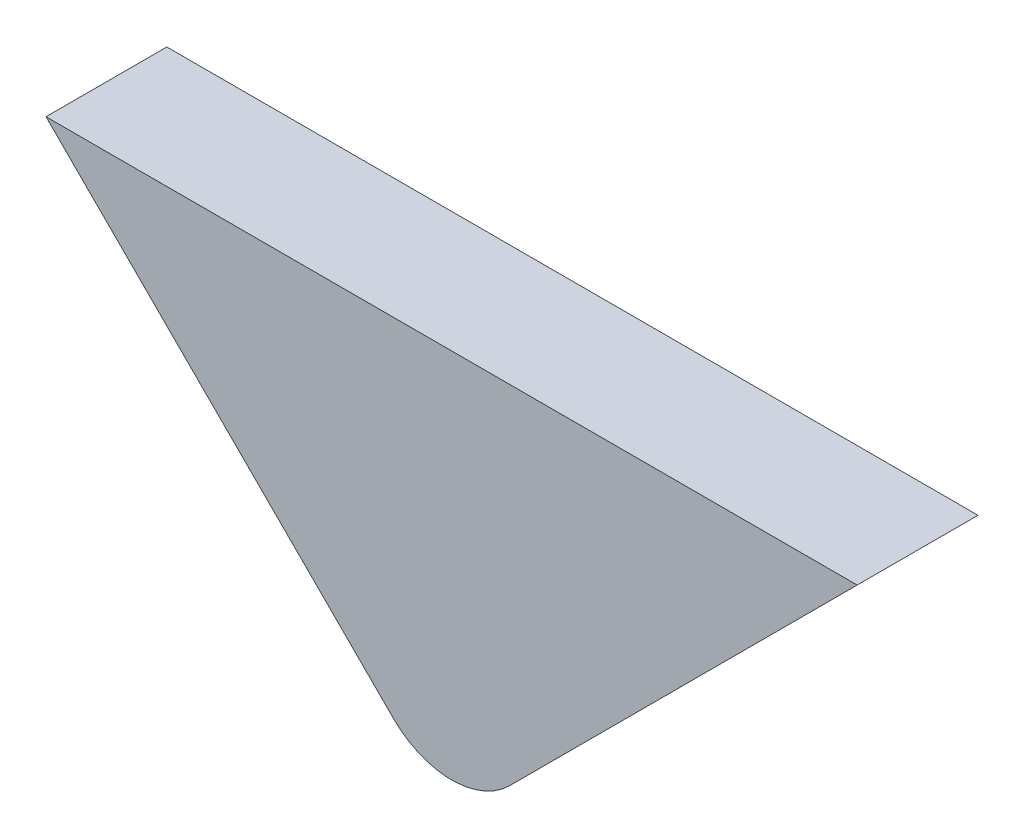
ISO-10303-21;
HEADER;
FILE_DESCRIPTION(('STEP AP214'),'2;1');
FILE_NAME('part.step','',(''),(''),'','','');
FILE_SCHEMA(('AUTOMOTIVE_DESIGN { 1 0 10303 214 1 1 1 1 }'));
ENDSEC;
DATA;
#1=APPLICATION_CONTEXT('core data for automotive mechanical design processes');
#2=APPLICATION_PROTOCOL_DEFINITION('international standard','automotive_design',2000,#1);
#3=PRODUCT_CONTEXT('',#1,'mechanical');
#4=PRODUCT('Part','Part','',(#3));
#5=PRODUCT_RELATED_PRODUCT_CATEGORY('part','',(#4));
#6=PRODUCT_DEFINITION_FORMATION('','',#4);
#7=PRODUCT_DEFINITION_CONTEXT('part definition',#1,'design');
#8=PRODUCT_DEFINITION('design','',#6,#7);
#9=PRODUCT_DEFINITION_SHAPE('','',#8);
#10=(LENGTH_UNIT() NAMED_UNIT(*) SI_UNIT(.MILLI.,.METRE.));
#11=(NAMED_UNIT(*) PLANE_ANGLE_UNIT() SI_UNIT($,.RADIAN.));
#12=(NAMED_UNIT(*) SI_UNIT($,.STERADIAN.) SOLID_ANGLE_UNIT());
#13=UNCERTAINTY_MEASURE_WITH_UNIT(LENGTH_MEASURE(1.E-05),#10,'distance_accuracy_value','');
#14=(GEOMETRIC_REPRESENTATION_CONTEXT(3) GLOBAL_UNCERTAINTY_ASSIGNED_CONTEXT((#13)) GLOBAL_UNIT_ASSIGNED_CONTEXT((#10,
#11,#12)) REPRESENTATION_CONTEXT('',''));
#15=CARTESIAN_POINT('',(0.,0.,0.));
#16=DIRECTION('',(0.,0.,1.));
#17=DIRECTION('',(1.,0.,0.));
#18=AXIS2_PLACEMENT_3D('',#15,#16,#17);
#19=CARTESIAN_POINT('',(0.,13.6568542494926,9.5));
#20=DIRECTION('',(0.,0.,-1.));
#21=DIRECTION('',(-1.,0.,0.));
#22=AXIS2_PLACEMENT_3D('',#19,#20,#21);
#23=CYLINDRICAL_SURFACE('',#22,6.45685424949255);
#24=CARTESIAN_POINT('',(0.,13.6568542494926,0.));
#25=DIRECTION('',(0.,0.,1.));
#26=DIRECTION('',(1.,0.,0.));
#27=AXIS2_PLACEMENT_3D('',#24,#25,#26);
#28=CIRCLE('',#27,6.45685424949255);
#29=CARTESIAN_POINT('',(-4.56568542494934,9.09116882454317,0.));
#30=VERTEX_POINT('',#29);
#31=CARTESIAN_POINT('',(4.56568542494934,9.09116882454317,0.));
#32=VERTEX_POINT('',#31);
#33=EDGE_CURVE('E95',#30,#32,#28,.T.);
#34=ORIENTED_EDGE('',*,*,#33,.T.);
#35=DIRECTION('',(0.,0.,-1.));
#36=VECTOR('',#35,1.);
#37=CARTESIAN_POINT('',(4.56568542494934,9.09116882454317,9.5));
#38=LINE('',#37,#36);
#39=CARTESIAN_POINT('',(4.56568542494934,9.09116882454317,9.5));
#40=VERTEX_POINT('',#39);
#41=EDGE_CURVE('E11',#40,#32,#38,.T.);
#42=ORIENTED_EDGE('',*,*,#41,.F.);
#43=CARTESIAN_POINT('',(0.,13.6568542494926,9.5));
#44=DIRECTION('',(0.,0.,1.));
#45=DIRECTION('',(1.,0.,0.));
#46=AXIS2_PLACEMENT_3D('',#43,#44,#45);
#47=CIRCLE('',#46,6.45685424949255);
#48=CARTESIAN_POINT('',(-4.56568542494934,9.09116882454317,9.5));
#49=VERTEX_POINT('',#48);
#50=EDGE_CURVE('E83',#49,#40,#47,.T.);
#51=ORIENTED_EDGE('',*,*,#50,.F.);
#52=DIRECTION('',(0.,0.,-1.));
#53=VECTOR('',#52,1.);
#54=CARTESIAN_POINT('',(-4.56568542494934,9.09116882454317,9.5));
#55=LINE('',#54,#53);
#56=EDGE_CURVE('E91',#49,#30,#55,.T.);
#57=ORIENTED_EDGE('',*,*,#56,.T.);
#58=EDGE_LOOP('',(#34,#42,#51,#57));
#59=FACE_BOUND('',#58,.T.);
#60=ADVANCED_FACE('F32',(#59),#23,.T.);
#61=CARTESIAN_POINT('',(4.56568542494934,9.09116882454317,9.5));
#62=DIRECTION('',(-0.707106781186544,0.707106781186551,0.));
#63=DIRECTION('',(-0.707106781186551,-0.707106781186544,0.));
#64=AXIS2_PLACEMENT_3D('',#61,#62,#63);
#65=PLANE('',#64);
#66=CARTESIAN_POINT('',(10.6773123959166,15.2027957955105,4.75));
#67=DIRECTION('',(-0.707106781186551,0.707106781186544,0.));
#68=DIRECTION('',(-0.707106781186544,-0.707106781186551,0.));
#69=AXIS2_PLACEMENT_3D('',#66,#67,#68);
#70=CIRCLE('',#69,1.5);
#71=CARTESIAN_POINT('',(9.61665222413675,14.1421356237306,4.75));
#72=VERTEX_POINT('',#71);
#73=EDGE_CURVE('E127',#72,#72,#70,.T.);
#74=ORIENTED_EDGE('',*,*,#73,.T.);
#75=EDGE_LOOP('',(#74));
#76=FACE_BOUND('',#75,.T.);
#77=CARTESIAN_POINT('',(21.2839141137147,25.8093975133087,4.75));
#78=DIRECTION('',(-0.707106781186551,0.707106781186544,0.));
#79=DIRECTION('',(-0.707106781186544,-0.707106781186551,0.));
#80=AXIS2_PLACEMENT_3D('',#77,#78,#79);
#81=CIRCLE('',#80,1.5);
#82=CARTESIAN_POINT('',(20.2232539419349,24.7487373415289,4.75));
#83=VERTEX_POINT('',#82);
#84=EDGE_CURVE('E121',#83,#83,#81,.T.);
#85=ORIENTED_EDGE('',*,*,#84,.T.);
#86=EDGE_LOOP('',(#85));
#87=FACE_BOUND('',#86,.T.);
#88=DIRECTION('',(0.707106781186551,0.707106781186544,0.));
#89=VECTOR('',#88,1.);
#90=CARTESIAN_POINT('',(4.56568542494934,9.09116882454317,0.));
#91=LINE('',#90,#89);
#92=CARTESIAN_POINT('',(31.8905158315135,36.415999231107,0.));
#93=VERTEX_POINT('',#92);
#94=EDGE_CURVE('E87',#32,#93,#91,.T.);
#95=ORIENTED_EDGE('',*,*,#94,.T.);
#96=DIRECTION('',(0.,0.,-1.));
#97=VECTOR('',#96,1.);
#98=CARTESIAN_POINT('',(31.8905158315135,36.415999231107,9.5));
#99=LINE('',#98,#97);
#100=CARTESIAN_POINT('',(31.8905158315135,36.415999231107,9.5));
#101=VERTEX_POINT('',#100);
#102=EDGE_CURVE('E40',#101,#93,#99,.T.);
#103=ORIENTED_EDGE('',*,*,#102,.F.);
#104=DIRECTION('',(0.707106781186551,0.707106781186544,0.));
#105=VECTOR('',#104,1.);
#106=CARTESIAN_POINT('',(4.56568542494934,9.09116882454317,9.5));
#107=LINE('',#106,#105);
#108=EDGE_CURVE('E78',#40,#101,#107,.T.);
#109=ORIENTED_EDGE('',*,*,#108,.F.);
#110=ORIENTED_EDGE('',*,*,#41,.T.);
#111=EDGE_LOOP('',(#95,#103,#109,#110));
#112=FACE_BOUND('',#111,.T.);
#113=ADVANCED_FACE('F86',(#76,#87,#112),#65,.F.);
#114=CARTESIAN_POINT('',(31.8905158315135,36.415999231107,9.5));
#115=DIRECTION('',(0.,-1.,0.));
#116=DIRECTION('',(1.,0.,0.));
#117=AXIS2_PLACEMENT_3D('',#114,#115,#116);
#118=PLANE('',#117);
#119=DIRECTION('',(-1.,0.,0.));
#120=VECTOR('',#119,1.);
#121=CARTESIAN_POINT('',(31.8905158315135,36.415999231107,0.));
#122=LINE('',#121,#120);
#123=CARTESIAN_POINT('',(-31.8905158315129,36.415999231107,0.));
#124=VERTEX_POINT('',#123);
#125=EDGE_CURVE('E65',#93,#124,#122,.T.);
#126=ORIENTED_EDGE('',*,*,#125,.T.);
#127=DIRECTION('',(0.,0.,-1.));
#128=VECTOR('',#127,1.);
#129=CARTESIAN_POINT('',(-31.8905158315129,36.415999231107,9.5));
#130=LINE('',#129,#128);
#131=CARTESIAN_POINT('',(-31.8905158315129,36.415999231107,9.5));
#132=VERTEX_POINT('',#131);
#133=EDGE_CURVE('E88',#132,#124,#130,.T.);
#134=ORIENTED_EDGE('',*,*,#133,.F.);
#135=DIRECTION('',(-1.,0.,0.));
#136=VECTOR('',#135,1.);
#137=CARTESIAN_POINT('',(31.8905158315135,36.415999231107,9.5));
#138=LINE('',#137,#136);
#139=EDGE_CURVE('E81',#101,#132,#138,.T.);
#140=ORIENTED_EDGE('',*,*,#139,.F.);
#141=ORIENTED_EDGE('',*,*,#102,.T.);
#142=EDGE_LOOP('',(#126,#134,#140,#141));
#143=FACE_BOUND('',#142,.T.);
#144=ADVANCED_FACE('F89',(#143),#118,.F.);
#145=CARTESIAN_POINT('',(-31.8905158315129,36.415999231107,9.5));
#146=DIRECTION('',(0.707106781186551,0.707106781186544,0.));
#147=DIRECTION('',(-0.707106781186544,0.707106781186551,0.));
#148=AXIS2_PLACEMENT_3D('',#145,#146,#147);
#149=PLANE('',#148);
#150=CARTESIAN_POINT('',(-10.6773123959166,15.2027957955105,4.75));
#151=DIRECTION('',(-0.707106781186551,-0.707106781186544,0.));
#152=DIRECTION('',(0.707106781186544,-0.707106781186551,0.));
#153=AXIS2_PLACEMENT_3D('',#150,#151,#152);
#154=CIRCLE('',#153,1.5);
#155=CARTESIAN_POINT('',(-9.61665222413675,14.1421356237306,4.75));
#156=VERTEX_POINT('',#155);
#157=EDGE_CURVE('E115',#156,#156,#154,.T.);
#158=ORIENTED_EDGE('',*,*,#157,.F.);
#159=EDGE_LOOP('',(#158));
#160=FACE_BOUND('',#159,.T.);
#161=CARTESIAN_POINT('',(-21.2839141137147,25.8093975133087,4.75));
#162=DIRECTION('',(-0.707106781186551,-0.707106781186544,0.));
#163=DIRECTION('',(0.707106781186544,-0.707106781186551,0.));
#164=AXIS2_PLACEMENT_3D('',#161,#162,#163);
#165=CIRCLE('',#164,1.5);
#166=CARTESIAN_POINT('',(-20.2232539419349,24.7487373415289,4.75));
#167=VERTEX_POINT('',#166);
#168=EDGE_CURVE('E109',#167,#167,#165,.T.);
#169=ORIENTED_EDGE('',*,*,#168,.F.);
#170=EDGE_LOOP('',(#169));
#171=FACE_BOUND('',#170,.T.);
#172=DIRECTION('',(0.707106781186544,-0.707106781186551,0.));
#173=VECTOR('',#172,1.);
#174=CARTESIAN_POINT('',(-31.8905158315129,36.415999231107,0.));
#175=LINE('',#174,#173);
#176=EDGE_CURVE('E71',#124,#30,#175,.T.);
#177=ORIENTED_EDGE('',*,*,#176,.T.);
#178=ORIENTED_EDGE('',*,*,#56,.F.);
#179=DIRECTION('',(0.707106781186544,-0.707106781186551,0.));
#180=VECTOR('',#179,1.);
#181=CARTESIAN_POINT('',(-31.8905158315129,36.415999231107,9.5));
#182=LINE('',#181,#180);
#183=EDGE_CURVE('E48',#132,#49,#182,.T.);
#184=ORIENTED_EDGE('',*,*,#183,.F.);
#185=ORIENTED_EDGE('',*,*,#133,.T.);
#186=EDGE_LOOP('',(#177,#178,#184,#185));
#187=FACE_BOUND('',#186,.T.);
#188=ADVANCED_FACE('F103',(#160,#171,#187),#149,.F.);
#189=CARTESIAN_POINT('',(0.,13.6568542494926,9.5));
#190=DIRECTION('',(0.,0.,1.));
#191=DIRECTION('',(1.,0.,0.));
#192=AXIS2_PLACEMENT_3D('',#189,#190,#191);
#193=PLANE('',#192);
#194=ORIENTED_EDGE('',*,*,#50,.T.);
#195=ORIENTED_EDGE('',*,*,#108,.T.);
#196=ORIENTED_EDGE('',*,*,#139,.T.);
#197=ORIENTED_EDGE('',*,*,#183,.T.);
#198=EDGE_LOOP('',(#194,#195,#196,#197));
#199=FACE_BOUND('',#198,.T.);
#200=ADVANCED_FACE('F79',(#199),#193,.T.);
#201=CARTESIAN_POINT('',(0.,13.6568542494926,0.));
#202=DIRECTION('',(0.,0.,1.));
#203=DIRECTION('',(1.,0.,0.));
#204=AXIS2_PLACEMENT_3D('',#201,#202,#203);
#205=PLANE('',#204);
#206=ORIENTED_EDGE('',*,*,#33,.F.);
#207=ORIENTED_EDGE('',*,*,#176,.F.);
#208=ORIENTED_EDGE('',*,*,#125,.F.);
#209=ORIENTED_EDGE('',*,*,#94,.F.);
#210=EDGE_LOOP('',(#206,#207,#208,#209));
#211=FACE_BOUND('',#210,.T.);
#212=ADVANCED_FACE('F106',(#211),#205,.F.);
#213=CARTESIAN_POINT('',(-13.5057395206627,33.5875721063607,4.75));
#214=DIRECTION('',(-0.707106781186551,-0.707106781186544,0.));
#215=DIRECTION('',(0.707106781186544,-0.707106781186551,0.));
#216=AXIS2_PLACEMENT_3D('',#213,#214,#215);
#217=CYLINDRICAL_SURFACE('',#216,1.5);
#218=CARTESIAN_POINT('',(-13.5057395206627,33.5875721063607,4.75));
#219=DIRECTION('',(-0.707106781186551,-0.707106781186544,0.));
#220=DIRECTION('',(0.707106781186544,-0.707106781186551,0.));
#221=AXIS2_PLACEMENT_3D('',#218,#219,#220);
#222=CIRCLE('',#221,1.5);
#223=CARTESIAN_POINT('',(-12.4450793488829,32.5269119345809,4.75));
#224=VERTEX_POINT('',#223);
#225=EDGE_CURVE('E98',#224,#224,#222,.T.);
#226=ORIENTED_EDGE('',*,*,#225,.F.);
#227=EDGE_LOOP('',(#226));
#228=FACE_BOUND('',#227,.T.);
#229=ORIENTED_EDGE('',*,*,#168,.T.);
#230=EDGE_LOOP('',(#229));
#231=FACE_BOUND('',#230,.T.);
#232=ADVANCED_FACE('F160',(#228,#231),#217,.F.);
#233=CARTESIAN_POINT('',(-13.5057395206627,33.5875721063607,4.75));
#234=DIRECTION('',(-0.707106781186551,-0.707106781186544,0.));
#235=DIRECTION('',(0.707106781186544,-0.707106781186551,0.));
#236=AXIS2_PLACEMENT_3D('',#233,#234,#235);
#237=PLANE('',#236);
#238=ORIENTED_EDGE('',*,*,#225,.T.);
#239=EDGE_LOOP('',(#238));
#240=FACE_BOUND('',#239,.T.);
#241=ADVANCED_FACE('F165',(#240),#237,.T.);
#242=CARTESIAN_POINT('',(-2.89913780286451,22.9809703885625,4.75));
#243=DIRECTION('',(-0.707106781186551,-0.707106781186544,0.));
#244=DIRECTION('',(0.707106781186544,-0.707106781186551,0.));
#245=AXIS2_PLACEMENT_3D('',#242,#243,#244);
#246=CYLINDRICAL_SURFACE('',#245,1.5);
#247=CARTESIAN_POINT('',(-2.89913780286451,22.9809703885625,4.75));
#248=DIRECTION('',(-0.707106781186551,-0.707106781186544,0.));
#249=DIRECTION('',(0.707106781186544,-0.707106781186551,0.));
#250=AXIS2_PLACEMENT_3D('',#247,#248,#249);
#251=CIRCLE('',#250,1.5);
#252=CARTESIAN_POINT('',(-1.83847763108469,21.9203102167826,4.75));
#253=VERTEX_POINT('',#252);
#254=EDGE_CURVE('E112',#253,#253,#251,.T.);
#255=ORIENTED_EDGE('',*,*,#254,.F.);
#256=EDGE_LOOP('',(#255));
#257=FACE_BOUND('',#256,.T.);
#258=ORIENTED_EDGE('',*,*,#157,.T.);
#259=EDGE_LOOP('',(#258));
#260=FACE_BOUND('',#259,.T.);
#261=ADVANCED_FACE('F169',(#257,#260),#246,.F.);
#262=CARTESIAN_POINT('',(-2.89913780286451,22.9809703885625,4.75));
#263=DIRECTION('',(-0.707106781186551,-0.707106781186544,0.));
#264=DIRECTION('',(0.707106781186544,-0.707106781186551,0.));
#265=AXIS2_PLACEMENT_3D('',#262,#263,#264);
#266=PLANE('',#265);
#267=ORIENTED_EDGE('',*,*,#254,.T.);
#268=EDGE_LOOP('',(#267));
#269=FACE_BOUND('',#268,.T.);
#270=ADVANCED_FACE('F173',(#269),#266,.T.);
#271=CARTESIAN_POINT('',(13.5057395206627,33.5875721063607,4.75));
#272=DIRECTION('',(0.707106781186551,-0.707106781186544,0.));
#273=DIRECTION('',(0.707106781186544,0.707106781186551,0.));
#274=AXIS2_PLACEMENT_3D('',#271,#272,#273);
#275=CYLINDRICAL_SURFACE('',#274,1.5);
#276=CARTESIAN_POINT('',(13.5057395206627,33.5875721063607,4.75));
#277=DIRECTION('',(-0.707106781186551,0.707106781186544,0.));
#278=DIRECTION('',(-0.707106781186544,-0.707106781186551,0.));
#279=AXIS2_PLACEMENT_3D('',#276,#277,#278);
#280=CIRCLE('',#279,1.5);
#281=CARTESIAN_POINT('',(12.4450793488829,32.5269119345809,4.75));
#282=VERTEX_POINT('',#281);
#283=EDGE_CURVE('E118',#282,#282,#280,.T.);
#284=ORIENTED_EDGE('',*,*,#283,.T.);
#285=EDGE_LOOP('',(#284));
#286=FACE_BOUND('',#285,.T.);
#287=ORIENTED_EDGE('',*,*,#84,.F.);
#288=EDGE_LOOP('',(#287));
#289=FACE_BOUND('',#288,.T.);
#290=ADVANCED_FACE('F177',(#286,#289),#275,.F.);
#291=CARTESIAN_POINT('',(13.5057395206627,33.5875721063607,4.75));
#292=DIRECTION('',(0.707106781186551,-0.707106781186544,0.));
#293=DIRECTION('',(-0.707106781186544,-0.707106781186551,0.));
#294=AXIS2_PLACEMENT_3D('',#291,#292,#293);
#295=PLANE('',#294);
#296=ORIENTED_EDGE('',*,*,#283,.F.);
#297=EDGE_LOOP('',(#296));
#298=FACE_BOUND('',#297,.T.);
#299=ADVANCED_FACE('F142',(#298),#295,.T.);
#300=CARTESIAN_POINT('',(2.89913780286451,22.9809703885625,4.75));
#301=DIRECTION('',(0.707106781186551,-0.707106781186544,0.));
#302=DIRECTION('',(0.707106781186544,0.707106781186551,0.));
#303=AXIS2_PLACEMENT_3D('',#300,#301,#302);
#304=CYLINDRICAL_SURFACE('',#303,1.5);
#305=CARTESIAN_POINT('',(2.89913780286451,22.9809703885625,4.75));
#306=DIRECTION('',(-0.707106781186551,0.707106781186544,0.));
#307=DIRECTION('',(-0.707106781186544,-0.707106781186551,0.));
#308=AXIS2_PLACEMENT_3D('',#305,#306,#307);
#309=CIRCLE('',#308,1.5);
#310=CARTESIAN_POINT('',(1.83847763108469,21.9203102167826,4.75));
#311=VERTEX_POINT('',#310);
#312=EDGE_CURVE('E124',#311,#311,#309,.T.);
#313=ORIENTED_EDGE('',*,*,#312,.T.);
#314=EDGE_LOOP('',(#313));
#315=FACE_BOUND('',#314,.T.);
#316=ORIENTED_EDGE('',*,*,#73,.F.);
#317=EDGE_LOOP('',(#316));
#318=FACE_BOUND('',#317,.T.);
#319=ADVANCED_FACE('F133',(#315,#318),#304,.F.);
#320=CARTESIAN_POINT('',(2.89913780286451,22.9809703885625,4.75));
#321=DIRECTION('',(0.707106781186551,-0.707106781186544,0.));
#322=DIRECTION('',(-0.707106781186544,-0.707106781186551,0.));
#323=AXIS2_PLACEMENT_3D('',#320,#321,#322);
#324=PLANE('',#323);
#325=ORIENTED_EDGE('',*,*,#312,.F.);
#326=EDGE_LOOP('',(#325));
#327=FACE_BOUND('',#326,.T.);
#328=ADVANCED_FACE('F136',(#327),#324,.T.);
#329=CLOSED_SHELL('',(#60,#113,#144,#188,#200,#212,#232,#241,#261,#270,#290,#299,#319,#328));
#330=MANIFOLD_SOLID_BREP('B2',#329);
#331=ADVANCED_BREP_SHAPE_REPRESENTATION('',(#18,#330),#14);
#332=SHAPE_DEFINITION_REPRESENTATION(#9,#331);
ENDSEC;
END-ISO-10303-21;
